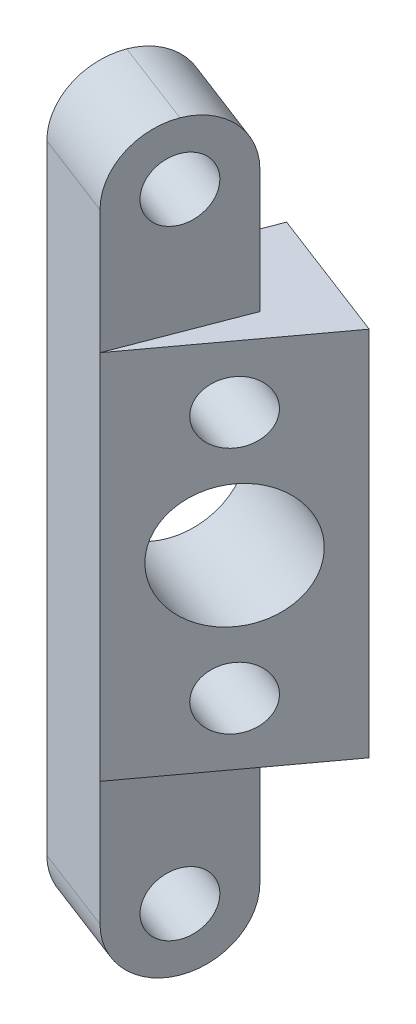
ISO-10303-21;
HEADER;
FILE_DESCRIPTION(('STEP AP214'),'2;1');
FILE_NAME('part.step','',(''),(''),'','','');
FILE_SCHEMA(('AUTOMOTIVE_DESIGN { 1 0 10303 214 1 1 1 1 }'));
ENDSEC;
DATA;
#1=APPLICATION_CONTEXT('core data for automotive mechanical design processes');
#2=APPLICATION_PROTOCOL_DEFINITION('international standard','automotive_design',2000,#1);
#3=PRODUCT_CONTEXT('',#1,'mechanical');
#4=PRODUCT('Part','Part','',(#3));
#5=PRODUCT_RELATED_PRODUCT_CATEGORY('part','',(#4));
#6=PRODUCT_DEFINITION_FORMATION('','',#4);
#7=PRODUCT_DEFINITION_CONTEXT('part definition',#1,'design');
#8=PRODUCT_DEFINITION('design','',#6,#7);
#9=PRODUCT_DEFINITION_SHAPE('','',#8);
#10=(LENGTH_UNIT() NAMED_UNIT(*) SI_UNIT(.MILLI.,.METRE.));
#11=(NAMED_UNIT(*) PLANE_ANGLE_UNIT() SI_UNIT($,.RADIAN.));
#12=(NAMED_UNIT(*) SI_UNIT($,.STERADIAN.) SOLID_ANGLE_UNIT());
#13=UNCERTAINTY_MEASURE_WITH_UNIT(LENGTH_MEASURE(1.E-05),#10,'distance_accuracy_value','');
#14=(GEOMETRIC_REPRESENTATION_CONTEXT(3) GLOBAL_UNCERTAINTY_ASSIGNED_CONTEXT((#13)) GLOBAL_UNIT_ASSIGNED_CONTEXT((#10,
#11,#12)) REPRESENTATION_CONTEXT('',''));
#15=CARTESIAN_POINT('',(0.,0.,0.));
#16=DIRECTION('',(0.,0.,1.));
#17=DIRECTION('',(1.,0.,0.));
#18=AXIS2_PLACEMENT_3D('',#15,#16,#17);
#19=CARTESIAN_POINT('',(0.,-15.,0.));
#20=DIRECTION('',(0.,-1.,0.));
#21=DIRECTION('',(0.,0.,-1.));
#22=AXIS2_PLACEMENT_3D('',#19,#20,#21);
#23=PLANE('',#22);
#24=DIRECTION('',(-0.593188938040395,0.,0.805063279367845));
#25=VECTOR('',#24,1.);
#26=CARTESIAN_POINT('',(17.2863392767661,-15.,-17.5728428570752));
#27=LINE('',#26,#25);
#28=CARTESIAN_POINT('',(9.98006870840117,-15.,-7.6569294498766));
#29=VERTEX_POINT('',#28);
#30=CARTESIAN_POINT('',(0.751589515940313,-15.,4.86776419462039));
#31=VERTEX_POINT('',#30);
#32=EDGE_CURVE('E137',#29,#31,#27,.T.);
#33=ORIENTED_EDGE('',*,*,#32,.T.);
#34=DIRECTION('',(0.358367949545312,0.,-0.933580426497197));
#35=VECTOR('',#34,1.);
#36=CARTESIAN_POINT('',(0.751589515940313,-15.,4.86776419462039));
#37=LINE('',#36,#35);
#38=CARTESIAN_POINT('',(4.33526901139343,-15.,-4.46804007035159));
#39=VERTEX_POINT('',#38);
#40=EDGE_CURVE('E120',#31,#39,#37,.T.);
#41=ORIENTED_EDGE('',*,*,#40,.T.);
#42=DIRECTION('',(-0.933580426497197,0.,-0.358367949545312));
#43=VECTOR('',#42,1.);
#44=CARTESIAN_POINT('',(4.33526901139343,-15.,-4.46804007035159));
#45=LINE('',#44,#43);
#46=CARTESIAN_POINT('',(-2.63931612809725,-15.,-7.14533246469463));
#47=VERTEX_POINT('',#46);
#48=EDGE_CURVE('E128',#39,#47,#45,.T.);
#49=ORIENTED_EDGE('',*,*,#48,.T.);
#50=DIRECTION('',(0.358367949545312,0.,-0.933580426497197));
#51=VECTOR('',#50,1.);
#52=CARTESIAN_POINT('',(-8.71365287289029,-15.,8.67885576443286));
#53=LINE('',#52,#51);
#54=CARTESIAN_POINT('',(-0.847476380370691,-15.,-11.8132345971806));
#55=VERTEX_POINT('',#54);
#56=EDGE_CURVE('E179',#47,#55,#53,.T.);
#57=ORIENTED_EDGE('',*,*,#56,.T.);
#58=DIRECTION('',(-0.933580426497197,0.,-0.358367949545312));
#59=VECTOR('',#58,1.);
#60=CARTESIAN_POINT('',(21.8133995086923,-15.,-3.1145393409678));
#61=LINE('',#60,#59);
#62=EDGE_CURVE('E191',#29,#55,#61,.T.);
#63=ORIENTED_EDGE('',*,*,#62,.F.);
#64=EDGE_LOOP('',(#33,#41,#49,#57,#63));
#65=FACE_BOUND('',#64,.T.);
#66=ADVANCED_FACE('F33',(#65),#23,.T.);
#67=CARTESIAN_POINT('',(0.,15.,0.));
#68=DIRECTION('',(0.,-1.,0.));
#69=DIRECTION('',(0.,0.,-1.));
#70=AXIS2_PLACEMENT_3D('',#67,#68,#69);
#71=PLANE('',#70);
#72=DIRECTION('',(-0.933580426497197,0.,-0.358367949545312));
#73=VECTOR('',#72,1.);
#74=CARTESIAN_POINT('',(4.33526901139343,15.,-4.46804007035159));
#75=LINE('',#74,#73);
#76=CARTESIAN_POINT('',(4.33526901139343,15.,-4.46804007035159));
#77=VERTEX_POINT('',#76);
#78=CARTESIAN_POINT('',(-2.63931612809725,15.,-7.14533246469463));
#79=VERTEX_POINT('',#78);
#80=EDGE_CURVE('E153',#77,#79,#75,.T.);
#81=ORIENTED_EDGE('',*,*,#80,.F.);
#82=DIRECTION('',(0.358367949545312,0.,-0.933580426497197));
#83=VECTOR('',#82,1.);
#84=CARTESIAN_POINT('',(0.751589515940313,15.,4.86776419462039));
#85=LINE('',#84,#83);
#86=CARTESIAN_POINT('',(0.751589515940313,15.,4.86776419462039));
#87=VERTEX_POINT('',#86);
#88=EDGE_CURVE('E150',#87,#77,#85,.T.);
#89=ORIENTED_EDGE('',*,*,#88,.F.);
#90=DIRECTION('',(-0.593188938040395,0.,0.805063279367845));
#91=VECTOR('',#90,1.);
#92=CARTESIAN_POINT('',(17.2863392767661,15.,-17.5728428570752));
#93=LINE('',#92,#91);
#94=CARTESIAN_POINT('',(9.98006870840117,15.,-7.6569294498766));
#95=VERTEX_POINT('',#94);
#96=EDGE_CURVE('E181',#95,#87,#93,.T.);
#97=ORIENTED_EDGE('',*,*,#96,.F.);
#98=DIRECTION('',(-0.933580426497197,0.,-0.358367949545312));
#99=VECTOR('',#98,1.);
#100=CARTESIAN_POINT('',(3.84345906774361,15.,-10.0125531879767));
#101=LINE('',#100,#99);
#102=CARTESIAN_POINT('',(-0.847476380370693,15.,-11.8132345971806));
#103=VERTEX_POINT('',#102);
#104=EDGE_CURVE('E174',#95,#103,#101,.T.);
#105=ORIENTED_EDGE('',*,*,#104,.T.);
#106=DIRECTION('',(0.358367949545312,0.,-0.933580426497197));
#107=VECTOR('',#106,1.);
#108=CARTESIAN_POINT('',(-8.71365287289029,15.,8.67885576443286));
#109=LINE('',#108,#107);
#110=EDGE_CURVE('E178',#79,#103,#109,.T.);
#111=ORIENTED_EDGE('',*,*,#110,.F.);
#112=EDGE_LOOP('',(#81,#89,#97,#105,#111));
#113=FACE_BOUND('',#112,.T.);
#114=ADVANCED_FACE('F259',(#113),#71,.F.);
#115=CARTESIAN_POINT('',(17.2863392767661,15.,-17.5728428570752));
#116=DIRECTION('',(0.805063279367845,0.,0.593188938040395));
#117=DIRECTION('',(0.593188938040395,0.,-0.805063279367845));
#118=AXIS2_PLACEMENT_3D('',#115,#116,#117);
#119=PLANE('',#118);
#120=CARTESIAN_POINT('',(5.36582911217074,10.,-1.3945826276281));
#121=DIRECTION('',(0.805063279367845,0.,0.593188938040395));
#122=DIRECTION('',(-0.593188938040395,0.,0.805063279367845));
#123=AXIS2_PLACEMENT_3D('',#120,#121,#122);
#124=ELLIPSE('',#123,2.59290045173668,2.5);
#125=CARTESIAN_POINT('',(3.8277492467606,10.,0.692866313121394));
#126=VERTEX_POINT('',#125);
#127=EDGE_CURVE('E171',#126,#126,#124,.T.);
#128=ORIENTED_EDGE('',*,*,#127,.F.);
#129=EDGE_LOOP('',(#128));
#130=FACE_BOUND('',#129,.T.);
#131=CARTESIAN_POINT('',(5.36582911217074,-10.,-1.3945826276281));
#132=DIRECTION('',(0.805063279367845,0.,0.593188938040395));
#133=DIRECTION('',(-0.593188938040395,0.,0.805063279367845));
#134=AXIS2_PLACEMENT_3D('',#131,#132,#133);
#135=ELLIPSE('',#134,2.59290045173668,2.5);
#136=CARTESIAN_POINT('',(3.8277492467606,-10.,0.692866313121391));
#137=VERTEX_POINT('',#136);
#138=EDGE_CURVE('E166',#137,#137,#135,.T.);
#139=ORIENTED_EDGE('',*,*,#138,.F.);
#140=EDGE_LOOP('',(#139));
#141=FACE_BOUND('',#140,.T.);
#142=DIRECTION('',(0.,-1.,0.));
#143=VECTOR('',#142,1.);
#144=CARTESIAN_POINT('',(9.98006870840117,15.,-7.6569294498766));
#145=LINE('',#144,#143);
#146=EDGE_CURVE('E189',#95,#29,#145,.T.);
#147=ORIENTED_EDGE('',*,*,#146,.F.);
#148=ORIENTED_EDGE('',*,*,#96,.T.);
#149=DIRECTION('',(0.,-1.,0.));
#150=VECTOR('',#149,1.);
#151=CARTESIAN_POINT('',(0.751589515940315,15.,4.86776419462039));
#152=LINE('',#151,#150);
#153=EDGE_CURVE('E192',#87,#31,#152,.T.);
#154=ORIENTED_EDGE('',*,*,#153,.T.);
#155=ORIENTED_EDGE('',*,*,#32,.F.);
#156=EDGE_LOOP('',(#147,#148,#154,#155));
#157=FACE_BOUND('',#156,.T.);
#158=CARTESIAN_POINT('',(5.36582911217074,0.,-1.39458262762811));
#159=DIRECTION('',(0.805063279367845,0.,0.593188938040395));
#160=DIRECTION('',(-0.593188938040395,0.,0.805063279367845));
#161=AXIS2_PLACEMENT_3D('',#158,#159,#160);
#162=ELLIPSE('',#161,5.18580090347336,5.);
#163=CARTESIAN_POINT('',(2.28966938135046,0.,2.78031525387089));
#164=VERTEX_POINT('',#163);
#165=EDGE_CURVE('E177',#164,#164,#162,.T.);
#166=ORIENTED_EDGE('',*,*,#165,.F.);
#167=EDGE_LOOP('',(#166));
#168=FACE_BOUND('',#167,.T.);
#169=ADVANCED_FACE('F266',(#130,#141,#157,#168),#119,.T.);
#170=CARTESIAN_POINT('',(-8.71365287289029,15.,8.67885576443286));
#171=DIRECTION('',(-0.933580426497197,0.,-0.358367949545312));
#172=DIRECTION('',(-0.358367949545312,0.,0.933580426497197));
#173=AXIS2_PLACEMENT_3D('',#170,#171,#172);
#174=PLANE('',#173);
#175=CARTESIAN_POINT('',(-4.43115587582381,-25.,-2.47743033220864));
#176=DIRECTION('',(-0.933580426497197,0.,-0.358367949545312));
#177=DIRECTION('',(-0.358367949545312,0.,0.933580426497197));
#178=AXIS2_PLACEMENT_3D('',#175,#176,#177);
#179=CIRCLE('',#178,2.5);
#180=CARTESIAN_POINT('',(-5.3270757496871,-25.,-0.143479265965651));
#181=VERTEX_POINT('',#180);
#182=EDGE_CURVE('E132',#181,#181,#179,.F.);
#183=ORIENTED_EDGE('',*,*,#182,.T.);
#184=EDGE_LOOP('',(#183));
#185=FACE_BOUND('',#184,.T.);
#186=CARTESIAN_POINT('',(-4.43115587582381,25.,-2.47743033220864));
#187=DIRECTION('',(-0.933580426497197,0.,-0.358367949545312));
#188=DIRECTION('',(-0.358367949545312,0.,0.933580426497197));
#189=AXIS2_PLACEMENT_3D('',#186,#187,#188);
#190=CIRCLE('',#189,2.5);
#191=CARTESIAN_POINT('',(-5.3270757496871,25.,-0.143479265965651));
#192=VERTEX_POINT('',#191);
#193=EDGE_CURVE('E147',#192,#192,#190,.T.);
#194=ORIENTED_EDGE('',*,*,#193,.F.);
#195=EDGE_LOOP('',(#194));
#196=FACE_BOUND('',#195,.T.);
#197=CARTESIAN_POINT('',(-3.53523600196054,10.,-4.81138139845164));
#198=DIRECTION('',(-0.933580426497197,0.,-0.358367949545312));
#199=DIRECTION('',(-0.358367949545312,0.,0.933580426497197));
#200=AXIS2_PLACEMENT_3D('',#197,#198,#199);
#201=CIRCLE('',#200,2.5);
#202=CARTESIAN_POINT('',(-4.43115587582382,10.,-2.47743033220865));
#203=VERTEX_POINT('',#202);
#204=EDGE_CURVE('E163',#203,#203,#201,.T.);
#205=ORIENTED_EDGE('',*,*,#204,.F.);
#206=EDGE_LOOP('',(#205));
#207=FACE_BOUND('',#206,.T.);
#208=CARTESIAN_POINT('',(-3.53523600196054,-10.,-4.81138139845164));
#209=DIRECTION('',(-0.933580426497197,0.,-0.358367949545312));
#210=DIRECTION('',(0.358367949545312,0.,-0.933580426497197));
#211=AXIS2_PLACEMENT_3D('',#208,#209,#210);
#212=CIRCLE('',#211,2.5);
#213=CARTESIAN_POINT('',(-2.63931612809726,-10.,-7.14533246469463));
#214=VERTEX_POINT('',#213);
#215=EDGE_CURVE('E162',#214,#214,#212,.T.);
#216=ORIENTED_EDGE('',*,*,#215,.F.);
#217=EDGE_LOOP('',(#216));
#218=FACE_BOUND('',#217,.T.);
#219=CARTESIAN_POINT('',(-4.43115587582382,-25.,-2.47743033220865));
#220=DIRECTION('',(-0.933580426497197,0.,-0.358367949545312));
#221=DIRECTION('',(-0.358367949545312,0.,0.933580426497197));
#222=AXIS2_PLACEMENT_3D('',#219,#220,#221);
#223=CIRCLE('',#222,5.);
#224=CARTESIAN_POINT('',(-2.63931612809725,-25.,-7.14533246469463));
#225=VERTEX_POINT('',#224);
#226=CARTESIAN_POINT('',(-4.43115587582381,-30.,-2.47743033220864));
#227=VERTEX_POINT('',#226);
#228=EDGE_CURVE('E49',#225,#227,#223,.T.);
#229=ORIENTED_EDGE('',*,*,#228,.T.);
#230=CARTESIAN_POINT('',(-4.43115587582382,-25.,-2.47743033220865));
#231=DIRECTION('',(-0.933580426497197,0.,-0.358367949545312));
#232=DIRECTION('',(-0.358367949545312,0.,0.933580426497197));
#233=AXIS2_PLACEMENT_3D('',#230,#231,#232);
#234=CIRCLE('',#233,5.);
#235=CARTESIAN_POINT('',(-6.22299562355037,-25.,2.19047180027734));
#236=VERTEX_POINT('',#235);
#237=EDGE_CURVE('E42',#227,#236,#234,.T.);
#238=ORIENTED_EDGE('',*,*,#237,.T.);
#239=DIRECTION('',(0.,1.,0.));
#240=VECTOR('',#239,1.);
#241=CARTESIAN_POINT('',(-6.22299562355037,0.,2.19047180027734));
#242=LINE('',#241,#240);
#243=CARTESIAN_POINT('',(-6.22299562355037,25.,2.19047180027734));
#244=VERTEX_POINT('',#243);
#245=EDGE_CURVE('E183',#236,#244,#242,.T.);
#246=ORIENTED_EDGE('',*,*,#245,.T.);
#247=CARTESIAN_POINT('',(-4.43115587582381,25.,-2.47743033220865));
#248=DIRECTION('',(-0.933580426497197,0.,-0.358367949545312));
#249=DIRECTION('',(-0.358367949545312,0.,0.933580426497197));
#250=AXIS2_PLACEMENT_3D('',#247,#248,#249);
#251=CIRCLE('',#250,5.);
#252=CARTESIAN_POINT('',(-4.43115587582381,30.,-2.47743033220864));
#253=VERTEX_POINT('',#252);
#254=EDGE_CURVE('E212',#244,#253,#251,.T.);
#255=ORIENTED_EDGE('',*,*,#254,.T.);
#256=CARTESIAN_POINT('',(-4.43115587582382,25.,-2.47743033220865));
#257=DIRECTION('',(-0.933580426497197,0.,-0.358367949545312));
#258=DIRECTION('',(-0.358367949545312,0.,0.933580426497197));
#259=AXIS2_PLACEMENT_3D('',#256,#257,#258);
#260=CIRCLE('',#259,5.);
#261=CARTESIAN_POINT('',(-2.63931612809725,25.,-7.14533246469463));
#262=VERTEX_POINT('',#261);
#263=EDGE_CURVE('E210',#253,#262,#260,.T.);
#264=ORIENTED_EDGE('',*,*,#263,.T.);
#265=DIRECTION('',(0.,-1.,0.));
#266=VECTOR('',#265,1.);
#267=CARTESIAN_POINT('',(-2.63931612809725,30.,-7.14533246469463));
#268=LINE('',#267,#266);
#269=EDGE_CURVE('E156',#262,#79,#268,.T.);
#270=ORIENTED_EDGE('',*,*,#269,.T.);
#271=ORIENTED_EDGE('',*,*,#110,.T.);
#272=DIRECTION('',(0.,1.,0.));
#273=VECTOR('',#272,1.);
#274=CARTESIAN_POINT('',(-0.847476380370692,0.,-11.8132345971806));
#275=LINE('',#274,#273);
#276=EDGE_CURVE('E197',#55,#103,#275,.T.);
#277=ORIENTED_EDGE('',*,*,#276,.F.);
#278=ORIENTED_EDGE('',*,*,#56,.F.);
#279=DIRECTION('',(0.,1.,0.));
#280=VECTOR('',#279,1.);
#281=CARTESIAN_POINT('',(-2.63931612809725,-30.,-7.14533246469463));
#282=LINE('',#281,#280);
#283=EDGE_CURVE('E124',#225,#47,#282,.T.);
#284=ORIENTED_EDGE('',*,*,#283,.F.);
#285=EDGE_LOOP('',(#229,#238,#246,#255,#264,#270,#271,#277,#278,#284));
#286=FACE_BOUND('',#285,.T.);
#287=CARTESIAN_POINT('',(-3.53523600196053,0.,-4.81138139845164));
#288=DIRECTION('',(-0.933580426497197,0.,-0.358367949545312));
#289=DIRECTION('',(-0.358367949545312,0.,0.933580426497197));
#290=AXIS2_PLACEMENT_3D('',#287,#288,#289);
#291=CIRCLE('',#290,5.);
#292=CARTESIAN_POINT('',(-5.3270757496871,0.,-0.143479265965652));
#293=VERTEX_POINT('',#292);
#294=EDGE_CURVE('E186',#293,#293,#291,.T.);
#295=ORIENTED_EDGE('',*,*,#294,.F.);
#296=EDGE_LOOP('',(#295));
#297=FACE_BOUND('',#296,.T.);
#298=ADVANCED_FACE('F227',(#185,#196,#207,#218,#286,#297),#174,.T.);
#299=CARTESIAN_POINT('',(19.1256398871025,0.,3.88731385776119));
#300=DIRECTION('',(-0.933580426497197,0.,-0.358367949545312));
#301=DIRECTION('',(-0.358367949545312,0.,0.933580426497197));
#302=AXIS2_PLACEMENT_3D('',#299,#300,#301);
#303=CYLINDRICAL_SURFACE('',#302,5.);
#304=ORIENTED_EDGE('',*,*,#165,.T.);
#305=EDGE_LOOP('',(#304));
#306=FACE_BOUND('',#305,.T.);
#307=ORIENTED_EDGE('',*,*,#294,.T.);
#308=EDGE_LOOP('',(#307));
#309=FACE_BOUND('',#308,.T.);
#310=ADVANCED_FACE('F314',(#306,#309),#303,.F.);
#311=CARTESIAN_POINT('',(16.4378802655127,0.,10.8891670564902));
#312=DIRECTION('',(-0.358367949545312,0.,0.933580426497197));
#313=DIRECTION('',(0.933580426497197,0.,0.358367949545312));
#314=AXIS2_PLACEMENT_3D('',#311,#312,#313);
#315=PLANE('',#314);
#316=ORIENTED_EDGE('',*,*,#245,.F.);
#317=DIRECTION('',(0.933580426497197,0.,0.358367949545312));
#318=VECTOR('',#317,1.);
#319=CARTESIAN_POINT('',(16.4378802655127,-25.,10.8891670564902));
#320=LINE('',#319,#318);
#321=CARTESIAN_POINT('',(0.751589515940313,-25.,4.86776419462039));
#322=VERTEX_POINT('',#321);
#323=EDGE_CURVE('E216',#236,#322,#320,.T.);
#324=ORIENTED_EDGE('',*,*,#323,.T.);
#325=DIRECTION('',(0.,1.,0.));
#326=VECTOR('',#325,1.);
#327=CARTESIAN_POINT('',(0.751589515940313,-30.,4.86776419462039));
#328=LINE('',#327,#326);
#329=EDGE_CURVE('E125',#322,#31,#328,.T.);
#330=ORIENTED_EDGE('',*,*,#329,.T.);
#331=ORIENTED_EDGE('',*,*,#153,.F.);
#332=DIRECTION('',(0.,-1.,0.));
#333=VECTOR('',#332,1.);
#334=CARTESIAN_POINT('',(0.751589515940313,30.,4.86776419462039));
#335=LINE('',#334,#333);
#336=CARTESIAN_POINT('',(0.751589515940313,25.,4.86776419462039));
#337=VERTEX_POINT('',#336);
#338=EDGE_CURVE('E160',#337,#87,#335,.T.);
#339=ORIENTED_EDGE('',*,*,#338,.F.);
#340=DIRECTION('',(0.933580426497197,0.,0.358367949545312));
#341=VECTOR('',#340,1.);
#342=CARTESIAN_POINT('',(16.4378802655127,25.,10.8891670564902));
#343=LINE('',#342,#341);
#344=EDGE_CURVE('E207',#337,#244,#343,.F.);
#345=ORIENTED_EDGE('',*,*,#344,.T.);
#346=EDGE_LOOP('',(#316,#324,#330,#331,#339,#345));
#347=FACE_BOUND('',#346,.T.);
#348=ADVANCED_FACE('F234',(#347),#315,.T.);
#349=CARTESIAN_POINT('',(21.8133995086923,0.,-3.1145393409678));
#350=DIRECTION('',(-0.358367949545312,0.,0.933580426497197));
#351=DIRECTION('',(0.933580426497197,0.,0.358367949545312));
#352=AXIS2_PLACEMENT_3D('',#349,#350,#351);
#353=PLANE('',#352);
#354=ORIENTED_EDGE('',*,*,#146,.T.);
#355=ORIENTED_EDGE('',*,*,#62,.T.);
#356=ORIENTED_EDGE('',*,*,#276,.T.);
#357=ORIENTED_EDGE('',*,*,#104,.F.);
#358=EDGE_LOOP('',(#354,#355,#356,#357));
#359=FACE_BOUND('',#358,.T.);
#360=ADVANCED_FACE('F313',(#359),#353,.F.);
#361=CARTESIAN_POINT('',(11.4826370132121,-10.,0.953439934802215));
#362=DIRECTION('',(-0.933580426497197,0.,-0.358367949545312));
#363=DIRECTION('',(-0.358367949545312,0.,0.933580426497197));
#364=AXIS2_PLACEMENT_3D('',#361,#362,#363);
#365=CYLINDRICAL_SURFACE('',#364,2.5);
#366=ORIENTED_EDGE('',*,*,#138,.T.);
#367=EDGE_LOOP('',(#366));
#368=FACE_BOUND('',#367,.T.);
#369=ORIENTED_EDGE('',*,*,#215,.T.);
#370=EDGE_LOOP('',(#369));
#371=FACE_BOUND('',#370,.T.);
#372=ADVANCED_FACE('F350',(#368,#371),#365,.F.);
#373=CARTESIAN_POINT('',(11.4826370132121,10.,0.953439934802215));
#374=DIRECTION('',(-0.933580426497197,0.,-0.358367949545312));
#375=DIRECTION('',(-0.358367949545312,0.,0.933580426497197));
#376=AXIS2_PLACEMENT_3D('',#373,#374,#375);
#377=CYLINDRICAL_SURFACE('',#376,2.5);
#378=ORIENTED_EDGE('',*,*,#127,.T.);
#379=EDGE_LOOP('',(#378));
#380=FACE_BOUND('',#379,.T.);
#381=ORIENTED_EDGE('',*,*,#204,.T.);
#382=EDGE_LOOP('',(#381));
#383=FACE_BOUND('',#382,.T.);
#384=ADVANCED_FACE('F358',(#380,#383),#377,.F.);
#385=CARTESIAN_POINT('',(0.751589515940313,30.,4.86776419462039));
#386=DIRECTION('',(-0.933580426497197,0.,-0.358367949545312));
#387=DIRECTION('',(-0.358367949545312,0.,0.933580426497197));
#388=AXIS2_PLACEMENT_3D('',#385,#386,#387);
#389=PLANE('',#388);
#390=CARTESIAN_POINT('',(2.54342926366687,25.,0.199862062134399));
#391=DIRECTION('',(0.933580426497197,0.,0.358367949545312));
#392=DIRECTION('',(0.358367949545312,0.,-0.933580426497197));
#393=AXIS2_PLACEMENT_3D('',#390,#391,#392);
#394=CIRCLE('',#393,2.5);
#395=CARTESIAN_POINT('',(3.43934913753015,25.,-2.13408900410859));
#396=VERTEX_POINT('',#395);
#397=EDGE_CURVE('E144',#396,#396,#394,.T.);
#398=ORIENTED_EDGE('',*,*,#397,.F.);
#399=EDGE_LOOP('',(#398));
#400=FACE_BOUND('',#399,.T.);
#401=CARTESIAN_POINT('',(2.54342926366687,25.,0.1998620621344));
#402=DIRECTION('',(-0.933580426497197,0.,-0.358367949545312));
#403=DIRECTION('',(-0.358367949545312,0.,0.933580426497197));
#404=AXIS2_PLACEMENT_3D('',#401,#402,#403);
#405=CIRCLE('',#404,5.);
#406=CARTESIAN_POINT('',(4.33526901139343,25.,-4.46804007035159));
#407=VERTEX_POINT('',#406);
#408=CARTESIAN_POINT('',(2.54342926366687,30.,0.1998620621344));
#409=VERTEX_POINT('',#408);
#410=EDGE_CURVE('E200',#407,#409,#405,.F.);
#411=ORIENTED_EDGE('',*,*,#410,.T.);
#412=CARTESIAN_POINT('',(2.54342926366687,25.,0.199862062134395));
#413=DIRECTION('',(-0.933580426497197,0.,-0.358367949545312));
#414=DIRECTION('',(-0.358367949545312,0.,0.933580426497197));
#415=AXIS2_PLACEMENT_3D('',#412,#413,#414);
#416=CIRCLE('',#415,5.);
#417=EDGE_CURVE('E205',#409,#337,#416,.F.);
#418=ORIENTED_EDGE('',*,*,#417,.T.);
#419=ORIENTED_EDGE('',*,*,#338,.T.);
#420=ORIENTED_EDGE('',*,*,#88,.T.);
#421=DIRECTION('',(0.,-1.,0.));
#422=VECTOR('',#421,1.);
#423=CARTESIAN_POINT('',(4.33526901139343,30.,-4.46804007035159));
#424=LINE('',#423,#422);
#425=EDGE_CURVE('E158',#407,#77,#424,.T.);
#426=ORIENTED_EDGE('',*,*,#425,.F.);
#427=EDGE_LOOP('',(#411,#418,#419,#420,#426));
#428=FACE_BOUND('',#427,.T.);
#429=ADVANCED_FACE('F366',(#400,#428),#389,.F.);
#430=CARTESIAN_POINT('',(4.33526901139343,30.,-4.46804007035159));
#431=DIRECTION('',(-0.358367949545312,0.,0.933580426497197));
#432=DIRECTION('',(0.933580426497197,0.,0.358367949545312));
#433=AXIS2_PLACEMENT_3D('',#430,#431,#432);
#434=PLANE('',#433);
#435=ORIENTED_EDGE('',*,*,#269,.F.);
#436=DIRECTION('',(-0.933580426497197,0.,-0.358367949545312));
#437=VECTOR('',#436,1.);
#438=CARTESIAN_POINT('',(4.33526901139343,25.,-4.46804007035159));
#439=LINE('',#438,#437);
#440=EDGE_CURVE('E214',#262,#407,#439,.F.);
#441=ORIENTED_EDGE('',*,*,#440,.T.);
#442=ORIENTED_EDGE('',*,*,#425,.T.);
#443=ORIENTED_EDGE('',*,*,#80,.T.);
#444=EDGE_LOOP('',(#435,#441,#442,#443));
#445=FACE_BOUND('',#444,.T.);
#446=ADVANCED_FACE('F375',(#445),#434,.F.);
#447=CARTESIAN_POINT('',(-11.4602771337911,25.,-5.17565718104528));
#448=DIRECTION('',(0.933580426497197,0.,0.358367949545312));
#449=DIRECTION('',(0.358367949545312,0.,-0.933580426497197));
#450=AXIS2_PLACEMENT_3D('',#447,#448,#449);
#451=CYLINDRICAL_SURFACE('',#450,2.5);
#452=ORIENTED_EDGE('',*,*,#193,.T.);
#453=EDGE_LOOP('',(#452));
#454=FACE_BOUND('',#453,.T.);
#455=ORIENTED_EDGE('',*,*,#397,.T.);
#456=EDGE_LOOP('',(#455));
#457=FACE_BOUND('',#456,.T.);
#458=ADVANCED_FACE('F277',(#454,#457),#451,.F.);
#459=CARTESIAN_POINT('',(0.259779572290487,25.,-0.676748923004755));
#460=DIRECTION('',(0.933580426497197,0.,0.358367949545312));
#461=DIRECTION('',(0.358367949545312,0.,-0.933580426497197));
#462=AXIS2_PLACEMENT_3D('',#459,#460,#461);
#463=CYLINDRICAL_SURFACE('',#462,5.);
#464=ORIENTED_EDGE('',*,*,#440,.F.);
#465=ORIENTED_EDGE('',*,*,#263,.F.);
#466=DIRECTION('',(-0.933580426497197,0.,-0.358367949545312));
#467=VECTOR('',#466,1.);
#468=CARTESIAN_POINT('',(-4.43115587582382,30.,-2.47743033220864));
#469=LINE('',#468,#467);
#470=EDGE_CURVE('E143',#409,#253,#469,.T.);
#471=ORIENTED_EDGE('',*,*,#470,.F.);
#472=ORIENTED_EDGE('',*,*,#410,.F.);
#473=EDGE_LOOP('',(#464,#465,#471,#472));
#474=FACE_BOUND('',#473,.T.);
#475=ADVANCED_FACE('F274',(#474),#463,.T.);
#476=CARTESIAN_POINT('',(0.259779572290489,25.,-0.67674892300476));
#477=DIRECTION('',(0.933580426497197,0.,0.358367949545312));
#478=DIRECTION('',(0.358367949545312,0.,-0.933580426497197));
#479=AXIS2_PLACEMENT_3D('',#476,#477,#478);
#480=CYLINDRICAL_SURFACE('',#479,5.);
#481=ORIENTED_EDGE('',*,*,#254,.F.);
#482=ORIENTED_EDGE('',*,*,#344,.F.);
#483=ORIENTED_EDGE('',*,*,#417,.F.);
#484=ORIENTED_EDGE('',*,*,#470,.T.);
#485=EDGE_LOOP('',(#481,#482,#483,#484));
#486=FACE_BOUND('',#485,.T.);
#487=ADVANCED_FACE('F271',(#486),#480,.T.);
#488=CARTESIAN_POINT('',(4.33526901139343,-30.,-4.46804007035159));
#489=DIRECTION('',(0.358367949545312,0.,-0.933580426497197));
#490=DIRECTION('',(-0.933580426497197,0.,-0.358367949545312));
#491=AXIS2_PLACEMENT_3D('',#488,#489,#490);
#492=PLANE('',#491);
#493=DIRECTION('',(0.,1.,0.));
#494=VECTOR('',#493,1.);
#495=CARTESIAN_POINT('',(4.33526901139343,-30.,-4.46804007035159));
#496=LINE('',#495,#494);
#497=CARTESIAN_POINT('',(4.33526901139343,-25.,-4.46804007035159));
#498=VERTEX_POINT('',#497);
#499=EDGE_CURVE('E115',#498,#39,#496,.T.);
#500=ORIENTED_EDGE('',*,*,#499,.F.);
#501=DIRECTION('',(-0.933580426497197,0.,-0.358367949545312));
#502=VECTOR('',#501,1.);
#503=CARTESIAN_POINT('',(4.33526901139343,-25.,-4.46804007035159));
#504=LINE('',#503,#502);
#505=EDGE_CURVE('E11',#498,#225,#504,.T.);
#506=ORIENTED_EDGE('',*,*,#505,.T.);
#507=ORIENTED_EDGE('',*,*,#283,.T.);
#508=ORIENTED_EDGE('',*,*,#48,.F.);
#509=EDGE_LOOP('',(#500,#506,#507,#508));
#510=FACE_BOUND('',#509,.T.);
#511=ADVANCED_FACE('F129',(#510),#492,.T.);
#512=CARTESIAN_POINT('',(0.751589515940313,-30.,4.86776419462039));
#513=DIRECTION('',(0.933580426497197,0.,0.358367949545312));
#514=DIRECTION('',(0.358367949545312,0.,-0.933580426497197));
#515=AXIS2_PLACEMENT_3D('',#512,#513,#514);
#516=PLANE('',#515);
#517=CARTESIAN_POINT('',(2.54342926366687,-25.,0.199862062134399));
#518=DIRECTION('',(-0.933580426497197,0.,-0.358367949545312));
#519=DIRECTION('',(0.358367949545312,0.,-0.933580426497197));
#520=AXIS2_PLACEMENT_3D('',#517,#518,#519);
#521=CIRCLE('',#520,2.5);
#522=CARTESIAN_POINT('',(3.43934913753015,-25.,-2.13408900410859));
#523=VERTEX_POINT('',#522);
#524=EDGE_CURVE('E239',#523,#523,#521,.T.);
#525=ORIENTED_EDGE('',*,*,#524,.T.);
#526=EDGE_LOOP('',(#525));
#527=FACE_BOUND('',#526,.T.);
#528=ORIENTED_EDGE('',*,*,#329,.F.);
#529=CARTESIAN_POINT('',(2.54342926366687,-25.,0.199862062134393));
#530=DIRECTION('',(0.933580426497197,0.,0.358367949545312));
#531=DIRECTION('',(0.358367949545312,0.,-0.933580426497197));
#532=AXIS2_PLACEMENT_3D('',#529,#530,#531);
#533=CIRCLE('',#532,5.);
#534=CARTESIAN_POINT('',(2.54342926366687,-30.,0.199862062134399));
#535=VERTEX_POINT('',#534);
#536=EDGE_CURVE('E222',#322,#535,#533,.T.);
#537=ORIENTED_EDGE('',*,*,#536,.T.);
#538=CARTESIAN_POINT('',(2.54342926366687,-25.,0.1998620621344));
#539=DIRECTION('',(0.933580426497197,0.,0.358367949545312));
#540=DIRECTION('',(0.358367949545312,0.,-0.933580426497197));
#541=AXIS2_PLACEMENT_3D('',#538,#539,#540);
#542=CIRCLE('',#541,5.);
#543=EDGE_CURVE('E123',#535,#498,#542,.T.);
#544=ORIENTED_EDGE('',*,*,#543,.T.);
#545=ORIENTED_EDGE('',*,*,#499,.T.);
#546=ORIENTED_EDGE('',*,*,#40,.F.);
#547=EDGE_LOOP('',(#528,#537,#544,#545,#546));
#548=FACE_BOUND('',#547,.T.);
#549=ADVANCED_FACE('F118',(#527,#548),#516,.T.);
#550=CARTESIAN_POINT('',(-11.4602771337911,-25.,-5.17565718104528));
#551=DIRECTION('',(0.933580426497197,0.,0.358367949545312));
#552=DIRECTION('',(0.358367949545312,0.,-0.933580426497197));
#553=AXIS2_PLACEMENT_3D('',#550,#551,#552);
#554=CYLINDRICAL_SURFACE('',#553,2.5);
#555=ORIENTED_EDGE('',*,*,#182,.F.);
#556=EDGE_LOOP('',(#555));
#557=FACE_BOUND('',#556,.T.);
#558=ORIENTED_EDGE('',*,*,#524,.F.);
#559=EDGE_LOOP('',(#558));
#560=FACE_BOUND('',#559,.T.);
#561=ADVANCED_FACE('F249',(#557,#560),#554,.F.);
#562=CARTESIAN_POINT('',(2.54342926366687,-25.,0.199862062134399));
#563=DIRECTION('',(-0.933580426497197,0.,-0.358367949545312));
#564=DIRECTION('',(-0.358367949545312,0.,0.933580426497197));
#565=AXIS2_PLACEMENT_3D('',#562,#563,#564);
#566=CYLINDRICAL_SURFACE('',#565,5.);
#567=DIRECTION('',(-0.933580426497197,0.,-0.358367949545312));
#568=VECTOR('',#567,1.);
#569=CARTESIAN_POINT('',(0.259779572290487,-30.,-0.676748923004755));
#570=LINE('',#569,#568);
#571=EDGE_CURVE('E37',#227,#535,#570,.F.);
#572=ORIENTED_EDGE('',*,*,#571,.F.);
#573=ORIENTED_EDGE('',*,*,#228,.F.);
#574=ORIENTED_EDGE('',*,*,#505,.F.);
#575=ORIENTED_EDGE('',*,*,#543,.F.);
#576=EDGE_LOOP('',(#572,#573,#574,#575));
#577=FACE_BOUND('',#576,.T.);
#578=ADVANCED_FACE('F35',(#577),#566,.T.);
#579=CARTESIAN_POINT('',(18.2297200132392,-25.,6.22126492400418));
#580=DIRECTION('',(0.933580426497197,0.,0.358367949545312));
#581=DIRECTION('',(0.358367949545312,0.,-0.933580426497197));
#582=AXIS2_PLACEMENT_3D('',#579,#580,#581);
#583=CYLINDRICAL_SURFACE('',#582,5.);
#584=ORIENTED_EDGE('',*,*,#237,.F.);
#585=ORIENTED_EDGE('',*,*,#571,.T.);
#586=ORIENTED_EDGE('',*,*,#536,.F.);
#587=ORIENTED_EDGE('',*,*,#323,.F.);
#588=EDGE_LOOP('',(#584,#585,#586,#587));
#589=FACE_BOUND('',#588,.T.);
#590=ADVANCED_FACE('F237',(#589),#583,.T.);
#591=CLOSED_SHELL('',(#66,#114,#169,#298,#310,#348,#360,#372,#384,#429,#446,#458,#475,#487,#511,
#549,#561,#578,#590));
#592=MANIFOLD_SOLID_BREP('B2',#591);
#593=ADVANCED_BREP_SHAPE_REPRESENTATION('',(#18,#592),#14);
#594=SHAPE_DEFINITION_REPRESENTATION(#9,#593);
ENDSEC;
END-ISO-10303-21;
